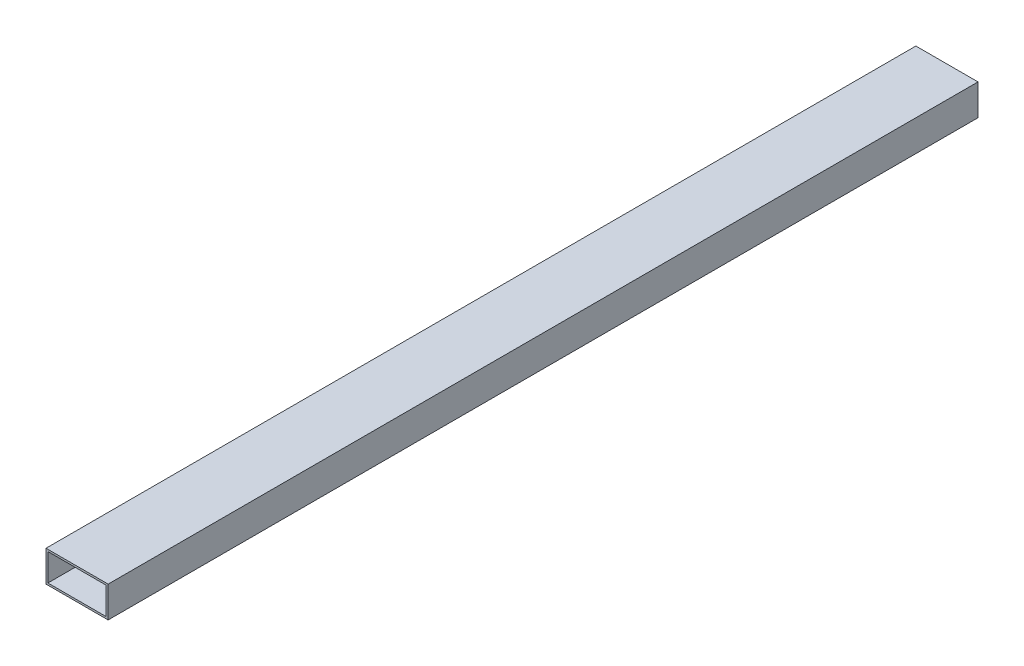
ISO-10303-21;
HEADER;
FILE_DESCRIPTION(('STEP AP214'),'2;1');
FILE_NAME('part.step','',(''),(''),'','','');
FILE_SCHEMA(('AUTOMOTIVE_DESIGN { 1 0 10303 214 1 1 1 1 }'));
ENDSEC;
DATA;
#1=APPLICATION_CONTEXT('core data for automotive mechanical design processes');
#2=APPLICATION_PROTOCOL_DEFINITION('international standard','automotive_design',2000,#1);
#3=PRODUCT_CONTEXT('',#1,'mechanical');
#4=PRODUCT('Part','Part','',(#3));
#5=PRODUCT_RELATED_PRODUCT_CATEGORY('part','',(#4));
#6=PRODUCT_DEFINITION_FORMATION('','',#4);
#7=PRODUCT_DEFINITION_CONTEXT('part definition',#1,'design');
#8=PRODUCT_DEFINITION('design','',#6,#7);
#9=PRODUCT_DEFINITION_SHAPE('','',#8);
#10=(LENGTH_UNIT() NAMED_UNIT(*) SI_UNIT(.MILLI.,.METRE.));
#11=(NAMED_UNIT(*) PLANE_ANGLE_UNIT() SI_UNIT($,.RADIAN.));
#12=(NAMED_UNIT(*) SI_UNIT($,.STERADIAN.) SOLID_ANGLE_UNIT());
#13=UNCERTAINTY_MEASURE_WITH_UNIT(LENGTH_MEASURE(1.E-05),#10,'distance_accuracy_value','');
#14=(GEOMETRIC_REPRESENTATION_CONTEXT(3) GLOBAL_UNCERTAINTY_ASSIGNED_CONTEXT((#13)) GLOBAL_UNIT_ASSIGNED_CONTEXT((#10,
#11,#12)) REPRESENTATION_CONTEXT('',''));
#15=CARTESIAN_POINT('',(0.,0.,0.));
#16=DIRECTION('',(0.,0.,1.));
#17=DIRECTION('',(1.,0.,0.));
#18=AXIS2_PLACEMENT_3D('',#15,#16,#17);
#19=CARTESIAN_POINT('',(0.,0.,711.2));
#20=DIRECTION('',(0.,0.,1.));
#21=DIRECTION('',(1.,0.,0.));
#22=AXIS2_PLACEMENT_3D('',#19,#20,#21);
#23=PLANE('',#22);
#24=DIRECTION('',(0.,-1.,0.));
#25=VECTOR('',#24,1.);
#26=CARTESIAN_POINT('',(-35.2408376963351,-1.1303664921466,711.2));
#27=LINE('',#26,#25);
#28=CARTESIAN_POINT('',(-35.2408376963351,24.2696335078534,711.2));
#29=VERTEX_POINT('',#28);
#30=CARTESIAN_POINT('',(-35.2408376963351,-1.1303664921466,711.2));
#31=VERTEX_POINT('',#30);
#32=EDGE_CURVE('E177',#29,#31,#27,.T.);
#33=ORIENTED_EDGE('',*,*,#32,.T.);
#34=DIRECTION('',(1.,0.,0.));
#35=VECTOR('',#34,1.);
#36=CARTESIAN_POINT('',(-35.2408376963351,-1.1303664921466,711.2));
#37=LINE('',#36,#35);
#38=CARTESIAN_POINT('',(15.5591623036649,-1.1303664921466,711.2));
#39=VERTEX_POINT('',#38);
#40=EDGE_CURVE('E181',#31,#39,#37,.T.);
#41=ORIENTED_EDGE('',*,*,#40,.T.);
#42=DIRECTION('',(0.,1.,0.));
#43=VECTOR('',#42,1.);
#44=CARTESIAN_POINT('',(15.5591623036649,-1.1303664921466,711.2));
#45=LINE('',#44,#43);
#46=CARTESIAN_POINT('',(15.5591623036649,24.2696335078534,711.2));
#47=VERTEX_POINT('',#46);
#48=EDGE_CURVE('E185',#39,#47,#45,.T.);
#49=ORIENTED_EDGE('',*,*,#48,.T.);
#50=DIRECTION('',(-1.,0.,0.));
#51=VECTOR('',#50,1.);
#52=CARTESIAN_POINT('',(-35.2408376963351,24.2696335078534,711.2));
#53=LINE('',#52,#51);
#54=EDGE_CURVE('E188',#47,#29,#53,.T.);
#55=ORIENTED_EDGE('',*,*,#54,.T.);
#56=EDGE_LOOP('',(#33,#41,#49,#55));
#57=FACE_BOUND('',#56,.T.);
#58=DIRECTION('',(1.,0.,0.));
#59=VECTOR('',#58,1.);
#60=CARTESIAN_POINT('',(0.,0.444433507853399,711.2));
#61=LINE('',#60,#59);
#62=CARTESIAN_POINT('',(-33.6660376963351,0.444433507853399,711.2));
#63=VERTEX_POINT('',#62);
#64=CARTESIAN_POINT('',(13.9843623036649,0.444433507853399,711.2));
#65=VERTEX_POINT('',#64);
#66=EDGE_CURVE('E138',#63,#65,#61,.T.);
#67=ORIENTED_EDGE('',*,*,#66,.F.);
#68=DIRECTION('',(0.,-1.,0.));
#69=VECTOR('',#68,1.);
#70=CARTESIAN_POINT('',(-33.6660376963351,0.,711.2));
#71=LINE('',#70,#69);
#72=CARTESIAN_POINT('',(-33.6660376963351,22.6948335078534,711.2));
#73=VERTEX_POINT('',#72);
#74=EDGE_CURVE('E129',#73,#63,#71,.T.);
#75=ORIENTED_EDGE('',*,*,#74,.F.);
#76=DIRECTION('',(-1.,0.,0.));
#77=VECTOR('',#76,1.);
#78=CARTESIAN_POINT('',(0.,22.6948335078534,711.2));
#79=LINE('',#78,#77);
#80=CARTESIAN_POINT('',(13.9843623036649,22.6948335078534,711.2));
#81=VERTEX_POINT('',#80);
#82=EDGE_CURVE('E155',#81,#73,#79,.T.);
#83=ORIENTED_EDGE('',*,*,#82,.F.);
#84=DIRECTION('',(0.,1.,0.));
#85=VECTOR('',#84,1.);
#86=CARTESIAN_POINT('',(13.9843623036649,0.,711.2));
#87=LINE('',#86,#85);
#88=EDGE_CURVE('E151',#65,#81,#87,.T.);
#89=ORIENTED_EDGE('',*,*,#88,.F.);
#90=EDGE_LOOP('',(#67,#75,#83,#89));
#91=FACE_BOUND('',#90,.T.);
#92=ADVANCED_FACE('F63',(#57,#91),#23,.T.);
#93=CARTESIAN_POINT('',(0.,0.,0.));
#94=DIRECTION('',(0.,0.,1.));
#95=DIRECTION('',(1.,0.,0.));
#96=AXIS2_PLACEMENT_3D('',#93,#94,#95);
#97=PLANE('',#96);
#98=DIRECTION('',(0.,-1.,0.));
#99=VECTOR('',#98,1.);
#100=CARTESIAN_POINT('',(-35.2408376963351,-1.1303664921466,0.));
#101=LINE('',#100,#99);
#102=CARTESIAN_POINT('',(-35.2408376963351,24.2696335078534,0.));
#103=VERTEX_POINT('',#102);
#104=CARTESIAN_POINT('',(-35.2408376963351,-1.1303664921466,0.));
#105=VERTEX_POINT('',#104);
#106=EDGE_CURVE('E147',#103,#105,#101,.T.);
#107=ORIENTED_EDGE('',*,*,#106,.F.);
#108=DIRECTION('',(-1.,0.,0.));
#109=VECTOR('',#108,1.);
#110=CARTESIAN_POINT('',(-35.2408376963351,24.2696335078534,0.));
#111=LINE('',#110,#109);
#112=CARTESIAN_POINT('',(15.5591623036649,24.2696335078534,0.));
#113=VERTEX_POINT('',#112);
#114=EDGE_CURVE('E182',#113,#103,#111,.T.);
#115=ORIENTED_EDGE('',*,*,#114,.F.);
#116=DIRECTION('',(0.,1.,0.));
#117=VECTOR('',#116,1.);
#118=CARTESIAN_POINT('',(15.5591623036649,-1.1303664921466,0.));
#119=LINE('',#118,#117);
#120=CARTESIAN_POINT('',(15.5591623036649,-1.1303664921466,0.));
#121=VERTEX_POINT('',#120);
#122=EDGE_CURVE('E198',#121,#113,#119,.T.);
#123=ORIENTED_EDGE('',*,*,#122,.F.);
#124=DIRECTION('',(1.,0.,0.));
#125=VECTOR('',#124,1.);
#126=CARTESIAN_POINT('',(-35.2408376963351,-1.1303664921466,0.));
#127=LINE('',#126,#125);
#128=EDGE_CURVE('E195',#105,#121,#127,.T.);
#129=ORIENTED_EDGE('',*,*,#128,.F.);
#130=EDGE_LOOP('',(#107,#115,#123,#129));
#131=FACE_BOUND('',#130,.T.);
#132=DIRECTION('',(0.,-1.,0.));
#133=VECTOR('',#132,1.);
#134=CARTESIAN_POINT('',(-33.6660376963351,0.,0.));
#135=LINE('',#134,#133);
#136=CARTESIAN_POINT('',(-33.6660376963351,22.6948335078534,0.));
#137=VERTEX_POINT('',#136);
#138=CARTESIAN_POINT('',(-33.6660376963351,0.444433507853399,0.));
#139=VERTEX_POINT('',#138);
#140=EDGE_CURVE('E87',#137,#139,#135,.T.);
#141=ORIENTED_EDGE('',*,*,#140,.T.);
#142=DIRECTION('',(1.,0.,0.));
#143=VECTOR('',#142,1.);
#144=CARTESIAN_POINT('',(0.,0.444433507853399,0.));
#145=LINE('',#144,#143);
#146=CARTESIAN_POINT('',(13.9843623036649,0.444433507853399,0.));
#147=VERTEX_POINT('',#146);
#148=EDGE_CURVE('E145',#139,#147,#145,.T.);
#149=ORIENTED_EDGE('',*,*,#148,.T.);
#150=DIRECTION('',(0.,1.,0.));
#151=VECTOR('',#150,1.);
#152=CARTESIAN_POINT('',(13.9843623036649,0.,0.));
#153=LINE('',#152,#151);
#154=CARTESIAN_POINT('',(13.9843623036649,22.6948335078534,0.));
#155=VERTEX_POINT('',#154);
#156=EDGE_CURVE('E164',#147,#155,#153,.T.);
#157=ORIENTED_EDGE('',*,*,#156,.T.);
#158=DIRECTION('',(-1.,0.,0.));
#159=VECTOR('',#158,1.);
#160=CARTESIAN_POINT('',(0.,22.6948335078534,0.));
#161=LINE('',#160,#159);
#162=EDGE_CURVE('E139',#155,#137,#161,.T.);
#163=ORIENTED_EDGE('',*,*,#162,.T.);
#164=EDGE_LOOP('',(#141,#149,#157,#163));
#165=FACE_BOUND('',#164,.T.);
#166=ADVANCED_FACE('F221',(#131,#165),#97,.F.);
#167=CARTESIAN_POINT('',(-35.2408376963351,-1.1303664921466,711.2));
#168=DIRECTION('',(1.,0.,0.));
#169=DIRECTION('',(0.,0.,-1.));
#170=AXIS2_PLACEMENT_3D('',#167,#168,#169);
#171=PLANE('',#170);
#172=ORIENTED_EDGE('',*,*,#106,.T.);
#173=DIRECTION('',(0.,0.,-1.));
#174=VECTOR('',#173,1.);
#175=CARTESIAN_POINT('',(-35.2408376963351,-1.1303664921466,711.2));
#176=LINE('',#175,#174);
#177=EDGE_CURVE('E12',#31,#105,#176,.T.);
#178=ORIENTED_EDGE('',*,*,#177,.F.);
#179=ORIENTED_EDGE('',*,*,#32,.F.);
#180=DIRECTION('',(0.,0.,-1.));
#181=VECTOR('',#180,1.);
#182=CARTESIAN_POINT('',(-35.2408376963351,24.2696335078534,711.2));
#183=LINE('',#182,#181);
#184=EDGE_CURVE('E191',#29,#103,#183,.T.);
#185=ORIENTED_EDGE('',*,*,#184,.T.);
#186=EDGE_LOOP('',(#172,#178,#179,#185));
#187=FACE_BOUND('',#186,.T.);
#188=ADVANCED_FACE('F65',(#187),#171,.F.);
#189=CARTESIAN_POINT('',(-35.2408376963351,-1.1303664921466,711.2));
#190=DIRECTION('',(0.,1.,0.));
#191=DIRECTION('',(0.,0.,1.));
#192=AXIS2_PLACEMENT_3D('',#189,#190,#191);
#193=PLANE('',#192);
#194=ORIENTED_EDGE('',*,*,#128,.T.);
#195=DIRECTION('',(0.,0.,-1.));
#196=VECTOR('',#195,1.);
#197=CARTESIAN_POINT('',(15.5591623036649,-1.1303664921466,711.2));
#198=LINE('',#197,#196);
#199=EDGE_CURVE('E72',#39,#121,#198,.T.);
#200=ORIENTED_EDGE('',*,*,#199,.F.);
#201=ORIENTED_EDGE('',*,*,#40,.F.);
#202=ORIENTED_EDGE('',*,*,#177,.T.);
#203=EDGE_LOOP('',(#194,#200,#201,#202));
#204=FACE_BOUND('',#203,.T.);
#205=ADVANCED_FACE('F231',(#204),#193,.F.);
#206=CARTESIAN_POINT('',(15.5591623036649,-1.1303664921466,711.2));
#207=DIRECTION('',(-1.,0.,0.));
#208=DIRECTION('',(0.,0.,1.));
#209=AXIS2_PLACEMENT_3D('',#206,#207,#208);
#210=PLANE('',#209);
#211=ORIENTED_EDGE('',*,*,#122,.T.);
#212=DIRECTION('',(0.,0.,-1.));
#213=VECTOR('',#212,1.);
#214=CARTESIAN_POINT('',(15.5591623036649,24.2696335078534,711.2));
#215=LINE('',#214,#213);
#216=EDGE_CURVE('E206',#47,#113,#215,.T.);
#217=ORIENTED_EDGE('',*,*,#216,.F.);
#218=ORIENTED_EDGE('',*,*,#48,.F.);
#219=ORIENTED_EDGE('',*,*,#199,.T.);
#220=EDGE_LOOP('',(#211,#217,#218,#219));
#221=FACE_BOUND('',#220,.T.);
#222=ADVANCED_FACE('F215',(#221),#210,.F.);
#223=CARTESIAN_POINT('',(-35.2408376963351,24.2696335078534,711.2));
#224=DIRECTION('',(0.,-1.,0.));
#225=DIRECTION('',(0.,0.,-1.));
#226=AXIS2_PLACEMENT_3D('',#223,#224,#225);
#227=PLANE('',#226);
#228=ORIENTED_EDGE('',*,*,#114,.T.);
#229=ORIENTED_EDGE('',*,*,#184,.F.);
#230=ORIENTED_EDGE('',*,*,#54,.F.);
#231=ORIENTED_EDGE('',*,*,#216,.T.);
#232=EDGE_LOOP('',(#228,#229,#230,#231));
#233=FACE_BOUND('',#232,.T.);
#234=ADVANCED_FACE('F225',(#233),#227,.F.);
#235=CARTESIAN_POINT('',(-33.6660376963351,0.,711.2));
#236=DIRECTION('',(1.,0.,0.));
#237=DIRECTION('',(0.,0.,-1.));
#238=AXIS2_PLACEMENT_3D('',#235,#236,#237);
#239=PLANE('',#238);
#240=ORIENTED_EDGE('',*,*,#140,.F.);
#241=DIRECTION('',(0.,0.,-1.));
#242=VECTOR('',#241,1.);
#243=CARTESIAN_POINT('',(-33.6660376963351,22.6948335078534,711.2));
#244=LINE('',#243,#242);
#245=EDGE_CURVE('E133',#73,#137,#244,.T.);
#246=ORIENTED_EDGE('',*,*,#245,.F.);
#247=ORIENTED_EDGE('',*,*,#74,.T.);
#248=DIRECTION('',(0.,0.,-1.));
#249=VECTOR('',#248,1.);
#250=CARTESIAN_POINT('',(-33.6660376963351,0.444433507853399,711.2));
#251=LINE('',#250,#249);
#252=EDGE_CURVE('E132',#63,#139,#251,.T.);
#253=ORIENTED_EDGE('',*,*,#252,.T.);
#254=EDGE_LOOP('',(#240,#246,#247,#253));
#255=FACE_BOUND('',#254,.T.);
#256=ADVANCED_FACE('F131',(#255),#239,.T.);
#257=CARTESIAN_POINT('',(0.,0.444433507853399,711.2));
#258=DIRECTION('',(0.,1.,0.));
#259=DIRECTION('',(0.,0.,1.));
#260=AXIS2_PLACEMENT_3D('',#257,#258,#259);
#261=PLANE('',#260);
#262=ORIENTED_EDGE('',*,*,#148,.F.);
#263=ORIENTED_EDGE('',*,*,#252,.F.);
#264=ORIENTED_EDGE('',*,*,#66,.T.);
#265=DIRECTION('',(0.,0.,-1.));
#266=VECTOR('',#265,1.);
#267=CARTESIAN_POINT('',(13.9843623036649,0.444433507853399,711.2));
#268=LINE('',#267,#266);
#269=EDGE_CURVE('E148',#65,#147,#268,.T.);
#270=ORIENTED_EDGE('',*,*,#269,.T.);
#271=EDGE_LOOP('',(#262,#263,#264,#270));
#272=FACE_BOUND('',#271,.T.);
#273=ADVANCED_FACE('F142',(#272),#261,.T.);
#274=CARTESIAN_POINT('',(13.9843623036649,0.,711.2));
#275=DIRECTION('',(-1.,0.,0.));
#276=DIRECTION('',(0.,0.,1.));
#277=AXIS2_PLACEMENT_3D('',#274,#275,#276);
#278=PLANE('',#277);
#279=ORIENTED_EDGE('',*,*,#156,.F.);
#280=ORIENTED_EDGE('',*,*,#269,.F.);
#281=ORIENTED_EDGE('',*,*,#88,.T.);
#282=DIRECTION('',(0.,0.,-1.));
#283=VECTOR('',#282,1.);
#284=CARTESIAN_POINT('',(13.9843623036649,22.6948335078534,711.2));
#285=LINE('',#284,#283);
#286=EDGE_CURVE('E79',#81,#155,#285,.T.);
#287=ORIENTED_EDGE('',*,*,#286,.T.);
#288=EDGE_LOOP('',(#279,#280,#281,#287));
#289=FACE_BOUND('',#288,.T.);
#290=ADVANCED_FACE('F254',(#289),#278,.T.);
#291=CARTESIAN_POINT('',(0.,22.6948335078534,711.2));
#292=DIRECTION('',(0.,-1.,0.));
#293=DIRECTION('',(0.,0.,-1.));
#294=AXIS2_PLACEMENT_3D('',#291,#292,#293);
#295=PLANE('',#294);
#296=ORIENTED_EDGE('',*,*,#162,.F.);
#297=ORIENTED_EDGE('',*,*,#286,.F.);
#298=ORIENTED_EDGE('',*,*,#82,.T.);
#299=ORIENTED_EDGE('',*,*,#245,.T.);
#300=EDGE_LOOP('',(#296,#297,#298,#299));
#301=FACE_BOUND('',#300,.T.);
#302=ADVANCED_FACE('F258',(#301),#295,.T.);
#303=CLOSED_SHELL('',(#92,#166,#188,#205,#222,#234,#256,#273,#290,#302));
#304=MANIFOLD_SOLID_BREP('B2',#303);
#305=ADVANCED_BREP_SHAPE_REPRESENTATION('',(#18,#304),#14);
#306=SHAPE_DEFINITION_REPRESENTATION(#9,#305);
ENDSEC;
END-ISO-10303-21;
